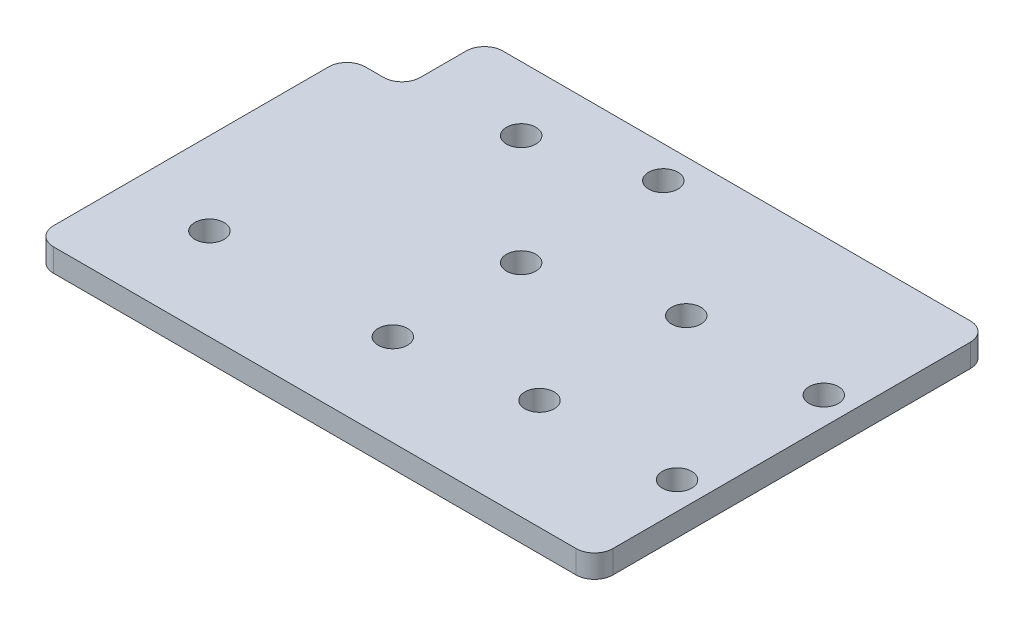
ISO-10303-21;
HEADER;
FILE_DESCRIPTION(('STEP AP214'),'2;1');
FILE_NAME('part.step','',(''),(''),'','','');
FILE_SCHEMA(('AUTOMOTIVE_DESIGN { 1 0 10303 214 1 1 1 1 }'));
ENDSEC;
DATA;
#1=APPLICATION_CONTEXT('core data for automotive mechanical design processes');
#2=APPLICATION_PROTOCOL_DEFINITION('international standard','automotive_design',2000,#1);
#3=PRODUCT_CONTEXT('',#1,'mechanical');
#4=PRODUCT('Part','Part','',(#3));
#5=PRODUCT_RELATED_PRODUCT_CATEGORY('part','',(#4));
#6=PRODUCT_DEFINITION_FORMATION('','',#4);
#7=PRODUCT_DEFINITION_CONTEXT('part definition',#1,'design');
#8=PRODUCT_DEFINITION('design','',#6,#7);
#9=PRODUCT_DEFINITION_SHAPE('','',#8);
#10=(LENGTH_UNIT() NAMED_UNIT(*) SI_UNIT(.MILLI.,.METRE.));
#11=(NAMED_UNIT(*) PLANE_ANGLE_UNIT() SI_UNIT($,.RADIAN.));
#12=(NAMED_UNIT(*) SI_UNIT($,.STERADIAN.) SOLID_ANGLE_UNIT());
#13=UNCERTAINTY_MEASURE_WITH_UNIT(LENGTH_MEASURE(1.E-05),#10,'distance_accuracy_value','');
#14=(GEOMETRIC_REPRESENTATION_CONTEXT(3) GLOBAL_UNCERTAINTY_ASSIGNED_CONTEXT((#13)) GLOBAL_UNIT_ASSIGNED_CONTEXT((#10,
#11,#12)) REPRESENTATION_CONTEXT('',''));
#15=CARTESIAN_POINT('',(0.,0.,0.));
#16=DIRECTION('',(0.,0.,1.));
#17=DIRECTION('',(1.,0.,0.));
#18=AXIS2_PLACEMENT_3D('',#15,#16,#17);
#19=CARTESIAN_POINT('',(0.,2.5,0.));
#20=DIRECTION('',(0.,1.,0.));
#21=DIRECTION('',(0.,0.,1.));
#22=AXIS2_PLACEMENT_3D('',#19,#20,#21);
#23=PLANE('',#22);
#24=CARTESIAN_POINT('',(-24.5,2.5,11.5));
#25=DIRECTION('',(0.,1.,0.));
#26=DIRECTION('',(0.,0.,1.));
#27=AXIS2_PLACEMENT_3D('',#24,#25,#26);
#28=CIRCLE('',#27,1.6);
#29=CARTESIAN_POINT('',(-24.5,2.5,13.1));
#30=VERTEX_POINT('',#29);
#31=EDGE_CURVE('E285',#30,#30,#28,.T.);
#32=ORIENTED_EDGE('',*,*,#31,.F.);
#33=EDGE_LOOP('',(#32));
#34=FACE_BOUND('',#33,.T.);
#35=CARTESIAN_POINT('',(-4.50000000000001,2.5,-2.5));
#36=DIRECTION('',(0.,1.,0.));
#37=DIRECTION('',(0.,0.,1.));
#38=AXIS2_PLACEMENT_3D('',#35,#36,#37);
#39=CIRCLE('',#38,1.6);
#40=CARTESIAN_POINT('',(-4.50000000000001,2.5,-0.900000000000004));
#41=VERTEX_POINT('',#40);
#42=EDGE_CURVE('E273',#41,#41,#39,.T.);
#43=ORIENTED_EDGE('',*,*,#42,.F.);
#44=EDGE_LOOP('',(#43));
#45=FACE_BOUND('',#44,.T.);
#46=CARTESIAN_POINT('',(9.50000000000001,2.5,-6.5));
#47=DIRECTION('',(0.,1.,0.));
#48=DIRECTION('',(0.,0.,1.));
#49=AXIS2_PLACEMENT_3D('',#46,#47,#48);
#50=CIRCLE('',#49,1.6);
#51=CARTESIAN_POINT('',(9.50000000000001,2.5,-4.9));
#52=VERTEX_POINT('',#51);
#53=EDGE_CURVE('E261',#52,#52,#50,.T.);
#54=ORIENTED_EDGE('',*,*,#53,.F.);
#55=EDGE_LOOP('',(#54));
#56=FACE_BOUND('',#55,.T.);
#57=CARTESIAN_POINT('',(9.50000000000001,2.5,9.5));
#58=DIRECTION('',(0.,1.,0.));
#59=DIRECTION('',(0.,0.,1.));
#60=AXIS2_PLACEMENT_3D('',#57,#58,#59);
#61=CIRCLE('',#60,1.6);
#62=CARTESIAN_POINT('',(9.50000000000001,2.5,11.1));
#63=VERTEX_POINT('',#62);
#64=EDGE_CURVE('E249',#63,#63,#61,.T.);
#65=ORIENTED_EDGE('',*,*,#64,.F.);
#66=EDGE_LOOP('',(#65));
#67=FACE_BOUND('',#66,.T.);
#68=DIRECTION('',(0.,0.,1.));
#69=VECTOR('',#68,1.);
#70=CARTESIAN_POINT('',(-33.5,2.5,21.5));
#71=LINE('',#70,#69);
#72=CARTESIAN_POINT('',(-33.5,2.5,-10.5));
#73=VERTEX_POINT('',#72);
#74=CARTESIAN_POINT('',(-33.5,2.5,19.5));
#75=VERTEX_POINT('',#74);
#76=EDGE_CURVE('E219',#73,#75,#71,.T.);
#77=ORIENTED_EDGE('',*,*,#76,.T.);
#78=CARTESIAN_POINT('',(-31.5,2.5,19.5));
#79=DIRECTION('',(0.,1.,0.));
#80=DIRECTION('',(0.,0.,1.));
#81=AXIS2_PLACEMENT_3D('',#78,#79,#80);
#82=CIRCLE('',#81,2.);
#83=CARTESIAN_POINT('',(-31.5,2.5,21.5));
#84=VERTEX_POINT('',#83);
#85=EDGE_CURVE('E182',#75,#84,#82,.T.);
#86=ORIENTED_EDGE('',*,*,#85,.T.);
#87=DIRECTION('',(1.,0.,0.));
#88=VECTOR('',#87,1.);
#89=CARTESIAN_POINT('',(-27.5,2.5,21.5));
#90=LINE('',#89,#88);
#91=CARTESIAN_POINT('',(25.5,2.5,21.5));
#92=VERTEX_POINT('',#91);
#93=EDGE_CURVE('E147',#84,#92,#90,.T.);
#94=ORIENTED_EDGE('',*,*,#93,.T.);
#95=CARTESIAN_POINT('',(25.5,2.5,19.5));
#96=DIRECTION('',(0.,1.,0.));
#97=DIRECTION('',(0.,0.,1.));
#98=AXIS2_PLACEMENT_3D('',#95,#96,#97);
#99=CIRCLE('',#98,2.);
#100=CARTESIAN_POINT('',(27.5,2.5,19.5));
#101=VERTEX_POINT('',#100);
#102=EDGE_CURVE('E174',#92,#101,#99,.T.);
#103=ORIENTED_EDGE('',*,*,#102,.T.);
#104=DIRECTION('',(0.,0.,-1.));
#105=VECTOR('',#104,1.);
#106=CARTESIAN_POINT('',(27.5,2.5,21.5));
#107=LINE('',#106,#105);
#108=CARTESIAN_POINT('',(27.5,2.5,-19.5));
#109=VERTEX_POINT('',#108);
#110=EDGE_CURVE('E154',#101,#109,#107,.T.);
#111=ORIENTED_EDGE('',*,*,#110,.T.);
#112=CARTESIAN_POINT('',(25.5,2.5,-19.5));
#113=DIRECTION('',(0.,1.,0.));
#114=DIRECTION('',(0.,0.,1.));
#115=AXIS2_PLACEMENT_3D('',#112,#113,#114);
#116=CIRCLE('',#115,2.);
#117=CARTESIAN_POINT('',(25.5,2.5,-21.5));
#118=VERTEX_POINT('',#117);
#119=EDGE_CURVE('E176',#109,#118,#116,.T.);
#120=ORIENTED_EDGE('',*,*,#119,.T.);
#121=DIRECTION('',(-1.,0.,0.));
#122=VECTOR('',#121,1.);
#123=CARTESIAN_POINT('',(27.5,2.5,-21.5));
#124=LINE('',#123,#122);
#125=CARTESIAN_POINT('',(-25.5,2.5,-21.5));
#126=VERTEX_POINT('',#125);
#127=EDGE_CURVE('E158',#118,#126,#124,.T.);
#128=ORIENTED_EDGE('',*,*,#127,.T.);
#129=CARTESIAN_POINT('',(-25.5,2.5,-19.5));
#130=DIRECTION('',(0.,1.,0.));
#131=DIRECTION('',(0.,0.,1.));
#132=AXIS2_PLACEMENT_3D('',#129,#130,#131);
#133=CIRCLE('',#132,2.);
#134=CARTESIAN_POINT('',(-27.5,2.5,-19.5));
#135=VERTEX_POINT('',#134);
#136=EDGE_CURVE('E178',#126,#135,#133,.T.);
#137=ORIENTED_EDGE('',*,*,#136,.T.);
#138=DIRECTION('',(0.,0.,1.));
#139=VECTOR('',#138,1.);
#140=CARTESIAN_POINT('',(-27.5,2.5,-12.5));
#141=LINE('',#140,#139);
#142=CARTESIAN_POINT('',(-27.5,2.5,-14.5));
#143=VERTEX_POINT('',#142);
#144=EDGE_CURVE('E220',#135,#143,#141,.T.);
#145=ORIENTED_EDGE('',*,*,#144,.T.);
#146=CARTESIAN_POINT('',(-29.5,2.5,-14.5));
#147=DIRECTION('',(0.,1.,0.));
#148=DIRECTION('',(0.,0.,1.));
#149=AXIS2_PLACEMENT_3D('',#146,#147,#148);
#150=CIRCLE('',#149,2.);
#151=CARTESIAN_POINT('',(-29.5,2.5,-12.5));
#152=VERTEX_POINT('',#151);
#153=EDGE_CURVE('E11',#143,#152,#150,.F.);
#154=ORIENTED_EDGE('',*,*,#153,.T.);
#155=DIRECTION('',(-1.,0.,0.));
#156=VECTOR('',#155,1.);
#157=CARTESIAN_POINT('',(-27.5,2.5,-12.5));
#158=LINE('',#157,#156);
#159=CARTESIAN_POINT('',(-31.5,2.5,-12.5));
#160=VERTEX_POINT('',#159);
#161=EDGE_CURVE('E217',#152,#160,#158,.T.);
#162=ORIENTED_EDGE('',*,*,#161,.T.);
#163=CARTESIAN_POINT('',(-31.5,2.5,-10.5));
#164=DIRECTION('',(0.,1.,0.));
#165=DIRECTION('',(0.,0.,1.));
#166=AXIS2_PLACEMENT_3D('',#163,#164,#165);
#167=CIRCLE('',#166,2.);
#168=EDGE_CURVE('E180',#160,#73,#167,.T.);
#169=ORIENTED_EDGE('',*,*,#168,.T.);
#170=EDGE_LOOP('',(#77,#86,#94,#103,#111,#120,#128,#137,#145,#154,#162,#169));
#171=FACE_BOUND('',#170,.T.);
#172=CARTESIAN_POINT('',(24.5,2.5,9.5));
#173=DIRECTION('',(0.,1.,0.));
#174=DIRECTION('',(0.,0.,1.));
#175=AXIS2_PLACEMENT_3D('',#172,#173,#174);
#176=CIRCLE('',#175,1.6);
#177=CARTESIAN_POINT('',(24.5,2.5,11.1));
#178=VERTEX_POINT('',#177);
#179=EDGE_CURVE('E231',#178,#178,#176,.T.);
#180=ORIENTED_EDGE('',*,*,#179,.F.);
#181=EDGE_LOOP('',(#180));
#182=FACE_BOUND('',#181,.T.);
#183=CARTESIAN_POINT('',(24.5,2.5,-6.5));
#184=DIRECTION('',(0.,1.,0.));
#185=DIRECTION('',(0.,0.,1.));
#186=AXIS2_PLACEMENT_3D('',#183,#184,#185);
#187=CIRCLE('',#186,1.60000000000001);
#188=CARTESIAN_POINT('',(24.5,2.5,-4.9));
#189=VERTEX_POINT('',#188);
#190=EDGE_CURVE('E255',#189,#189,#187,.T.);
#191=ORIENTED_EDGE('',*,*,#190,.F.);
#192=EDGE_LOOP('',(#191));
#193=FACE_BOUND('',#192,.T.);
#194=CARTESIAN_POINT('',(-4.50000000000001,2.5,-18.));
#195=DIRECTION('',(0.,1.,0.));
#196=DIRECTION('',(0.,0.,1.));
#197=AXIS2_PLACEMENT_3D('',#194,#195,#196);
#198=CIRCLE('',#197,1.6);
#199=CARTESIAN_POINT('',(-4.50000000000001,2.5,-16.4));
#200=VERTEX_POINT('',#199);
#201=EDGE_CURVE('E267',#200,#200,#198,.T.);
#202=ORIENTED_EDGE('',*,*,#201,.F.);
#203=EDGE_LOOP('',(#202));
#204=FACE_BOUND('',#203,.T.);
#205=CARTESIAN_POINT('',(-4.50000000000001,2.5,11.5));
#206=DIRECTION('',(0.,1.,0.));
#207=DIRECTION('',(0.,0.,1.));
#208=AXIS2_PLACEMENT_3D('',#205,#206,#207);
#209=CIRCLE('',#208,1.6);
#210=CARTESIAN_POINT('',(-4.50000000000001,2.5,13.1));
#211=VERTEX_POINT('',#210);
#212=EDGE_CURVE('E279',#211,#211,#209,.T.);
#213=ORIENTED_EDGE('',*,*,#212,.F.);
#214=EDGE_LOOP('',(#213));
#215=FACE_BOUND('',#214,.T.);
#216=CARTESIAN_POINT('',(-16.5,2.5,-14.5));
#217=DIRECTION('',(0.,1.,0.));
#218=DIRECTION('',(0.,0.,1.));
#219=AXIS2_PLACEMENT_3D('',#216,#217,#218);
#220=CIRCLE('',#219,1.6);
#221=CARTESIAN_POINT('',(-16.5,2.5,-12.9));
#222=VERTEX_POINT('',#221);
#223=EDGE_CURVE('E291',#222,#222,#220,.T.);
#224=ORIENTED_EDGE('',*,*,#223,.F.);
#225=EDGE_LOOP('',(#224));
#226=FACE_BOUND('',#225,.T.);
#227=ADVANCED_FACE('F38',(#34,#45,#56,#67,#171,#182,#193,#204,#215,#226),#23,.T.);
#228=CARTESIAN_POINT('',(0.,0.,0.));
#229=DIRECTION('',(0.,1.,0.));
#230=DIRECTION('',(0.,0.,1.));
#231=AXIS2_PLACEMENT_3D('',#228,#229,#230);
#232=PLANE('',#231);
#233=DIRECTION('',(1.,0.,0.));
#234=VECTOR('',#233,1.);
#235=CARTESIAN_POINT('',(27.5,0.,21.5));
#236=LINE('',#235,#234);
#237=CARTESIAN_POINT('',(-31.5,0.,21.5));
#238=VERTEX_POINT('',#237);
#239=CARTESIAN_POINT('',(25.5,0.,21.5));
#240=VERTEX_POINT('',#239);
#241=EDGE_CURVE('E144',#238,#240,#236,.T.);
#242=ORIENTED_EDGE('',*,*,#241,.F.);
#243=CARTESIAN_POINT('',(-31.5,0.,19.5));
#244=DIRECTION('',(0.,1.,0.));
#245=DIRECTION('',(0.,0.,1.));
#246=AXIS2_PLACEMENT_3D('',#243,#244,#245);
#247=CIRCLE('',#246,2.);
#248=CARTESIAN_POINT('',(-33.5,0.,19.5));
#249=VERTEX_POINT('',#248);
#250=EDGE_CURVE('E127',#238,#249,#247,.F.);
#251=ORIENTED_EDGE('',*,*,#250,.T.);
#252=DIRECTION('',(0.,0.,1.));
#253=VECTOR('',#252,1.);
#254=CARTESIAN_POINT('',(-33.5,0.,21.5));
#255=LINE('',#254,#253);
#256=CARTESIAN_POINT('',(-33.5,0.,-10.5));
#257=VERTEX_POINT('',#256);
#258=EDGE_CURVE('E155',#257,#249,#255,.T.);
#259=ORIENTED_EDGE('',*,*,#258,.F.);
#260=CARTESIAN_POINT('',(-31.5,0.,-10.5));
#261=DIRECTION('',(0.,1.,0.));
#262=DIRECTION('',(0.,0.,1.));
#263=AXIS2_PLACEMENT_3D('',#260,#261,#262);
#264=CIRCLE('',#263,2.);
#265=CARTESIAN_POINT('',(-31.5,0.,-12.5));
#266=VERTEX_POINT('',#265);
#267=EDGE_CURVE('E138',#257,#266,#264,.F.);
#268=ORIENTED_EDGE('',*,*,#267,.T.);
#269=DIRECTION('',(-1.,0.,0.));
#270=VECTOR('',#269,1.);
#271=CARTESIAN_POINT('',(-27.5,0.,-12.5));
#272=LINE('',#271,#270);
#273=CARTESIAN_POINT('',(-29.5,0.,-12.5));
#274=VERTEX_POINT('',#273);
#275=EDGE_CURVE('E160',#274,#266,#272,.T.);
#276=ORIENTED_EDGE('',*,*,#275,.F.);
#277=CARTESIAN_POINT('',(-29.5,0.,-14.5));
#278=DIRECTION('',(0.,1.,0.));
#279=DIRECTION('',(0.,0.,1.));
#280=AXIS2_PLACEMENT_3D('',#277,#278,#279);
#281=CIRCLE('',#280,2.);
#282=CARTESIAN_POINT('',(-27.5,0.,-14.5));
#283=VERTEX_POINT('',#282);
#284=EDGE_CURVE('E46',#274,#283,#281,.T.);
#285=ORIENTED_EDGE('',*,*,#284,.T.);
#286=DIRECTION('',(0.,0.,1.));
#287=VECTOR('',#286,1.);
#288=CARTESIAN_POINT('',(-27.5,0.,-12.5));
#289=LINE('',#288,#287);
#290=CARTESIAN_POINT('',(-27.5,0.,-19.5));
#291=VERTEX_POINT('',#290);
#292=EDGE_CURVE('E205',#291,#283,#289,.T.);
#293=ORIENTED_EDGE('',*,*,#292,.F.);
#294=CARTESIAN_POINT('',(-25.5,0.,-19.5));
#295=DIRECTION('',(0.,1.,0.));
#296=DIRECTION('',(0.,0.,1.));
#297=AXIS2_PLACEMENT_3D('',#294,#295,#296);
#298=CIRCLE('',#297,2.);
#299=CARTESIAN_POINT('',(-25.5,0.,-21.5));
#300=VERTEX_POINT('',#299);
#301=EDGE_CURVE('E168',#291,#300,#298,.F.);
#302=ORIENTED_EDGE('',*,*,#301,.T.);
#303=DIRECTION('',(-1.,0.,0.));
#304=VECTOR('',#303,1.);
#305=CARTESIAN_POINT('',(27.5,0.,-21.5));
#306=LINE('',#305,#304);
#307=CARTESIAN_POINT('',(25.5,0.,-21.5));
#308=VERTEX_POINT('',#307);
#309=EDGE_CURVE('E213',#308,#300,#306,.T.);
#310=ORIENTED_EDGE('',*,*,#309,.F.);
#311=CARTESIAN_POINT('',(25.5,0.,-19.5));
#312=DIRECTION('',(0.,1.,0.));
#313=DIRECTION('',(0.,0.,1.));
#314=AXIS2_PLACEMENT_3D('',#311,#312,#313);
#315=CIRCLE('',#314,2.);
#316=CARTESIAN_POINT('',(27.5,0.,-19.5));
#317=VERTEX_POINT('',#316);
#318=EDGE_CURVE('E166',#308,#317,#315,.F.);
#319=ORIENTED_EDGE('',*,*,#318,.T.);
#320=DIRECTION('',(0.,0.,-1.));
#321=VECTOR('',#320,1.);
#322=CARTESIAN_POINT('',(27.5,0.,21.5));
#323=LINE('',#322,#321);
#324=CARTESIAN_POINT('',(27.5,0.,19.5));
#325=VERTEX_POINT('',#324);
#326=EDGE_CURVE('E228',#325,#317,#323,.T.);
#327=ORIENTED_EDGE('',*,*,#326,.F.);
#328=CARTESIAN_POINT('',(25.5,0.,19.5));
#329=DIRECTION('',(0.,1.,0.));
#330=DIRECTION('',(0.,0.,1.));
#331=AXIS2_PLACEMENT_3D('',#328,#329,#330);
#332=CIRCLE('',#331,2.);
#333=EDGE_CURVE('E148',#325,#240,#332,.F.);
#334=ORIENTED_EDGE('',*,*,#333,.T.);
#335=EDGE_LOOP('',(#242,#251,#259,#268,#276,#285,#293,#302,#310,#319,#327,#334));
#336=FACE_BOUND('',#335,.T.);
#337=CARTESIAN_POINT('',(24.5,0.,9.5));
#338=DIRECTION('',(0.,1.,0.));
#339=DIRECTION('',(0.,0.,1.));
#340=AXIS2_PLACEMENT_3D('',#337,#338,#339);
#341=CIRCLE('',#340,1.6);
#342=CARTESIAN_POINT('',(24.5,0.,11.1));
#343=VERTEX_POINT('',#342);
#344=EDGE_CURVE('E246',#343,#343,#341,.T.);
#345=ORIENTED_EDGE('',*,*,#344,.T.);
#346=EDGE_LOOP('',(#345));
#347=FACE_BOUND('',#346,.T.);
#348=CARTESIAN_POINT('',(9.50000000000001,0.,9.5));
#349=DIRECTION('',(0.,1.,0.));
#350=DIRECTION('',(0.,0.,1.));
#351=AXIS2_PLACEMENT_3D('',#348,#349,#350);
#352=CIRCLE('',#351,1.6);
#353=CARTESIAN_POINT('',(9.50000000000001,0.,11.1));
#354=VERTEX_POINT('',#353);
#355=EDGE_CURVE('E252',#354,#354,#352,.T.);
#356=ORIENTED_EDGE('',*,*,#355,.T.);
#357=EDGE_LOOP('',(#356));
#358=FACE_BOUND('',#357,.T.);
#359=CARTESIAN_POINT('',(24.5,0.,-6.5));
#360=DIRECTION('',(0.,1.,0.));
#361=DIRECTION('',(0.,0.,1.));
#362=AXIS2_PLACEMENT_3D('',#359,#360,#361);
#363=CIRCLE('',#362,1.60000000000001);
#364=CARTESIAN_POINT('',(24.5,0.,-4.9));
#365=VERTEX_POINT('',#364);
#366=EDGE_CURVE('E258',#365,#365,#363,.T.);
#367=ORIENTED_EDGE('',*,*,#366,.T.);
#368=EDGE_LOOP('',(#367));
#369=FACE_BOUND('',#368,.T.);
#370=CARTESIAN_POINT('',(9.50000000000001,0.,-6.5));
#371=DIRECTION('',(0.,1.,0.));
#372=DIRECTION('',(0.,0.,1.));
#373=AXIS2_PLACEMENT_3D('',#370,#371,#372);
#374=CIRCLE('',#373,1.6);
#375=CARTESIAN_POINT('',(9.50000000000001,0.,-4.9));
#376=VERTEX_POINT('',#375);
#377=EDGE_CURVE('E264',#376,#376,#374,.T.);
#378=ORIENTED_EDGE('',*,*,#377,.T.);
#379=EDGE_LOOP('',(#378));
#380=FACE_BOUND('',#379,.T.);
#381=CARTESIAN_POINT('',(-4.50000000000001,0.,-18.));
#382=DIRECTION('',(0.,1.,0.));
#383=DIRECTION('',(0.,0.,1.));
#384=AXIS2_PLACEMENT_3D('',#381,#382,#383);
#385=CIRCLE('',#384,1.6);
#386=CARTESIAN_POINT('',(-4.50000000000001,0.,-16.4));
#387=VERTEX_POINT('',#386);
#388=EDGE_CURVE('E270',#387,#387,#385,.T.);
#389=ORIENTED_EDGE('',*,*,#388,.T.);
#390=EDGE_LOOP('',(#389));
#391=FACE_BOUND('',#390,.T.);
#392=CARTESIAN_POINT('',(-4.50000000000001,0.,-2.5));
#393=DIRECTION('',(0.,1.,0.));
#394=DIRECTION('',(0.,0.,1.));
#395=AXIS2_PLACEMENT_3D('',#392,#393,#394);
#396=CIRCLE('',#395,1.6);
#397=CARTESIAN_POINT('',(-4.50000000000001,0.,-0.900000000000004));
#398=VERTEX_POINT('',#397);
#399=EDGE_CURVE('E276',#398,#398,#396,.T.);
#400=ORIENTED_EDGE('',*,*,#399,.T.);
#401=EDGE_LOOP('',(#400));
#402=FACE_BOUND('',#401,.T.);
#403=CARTESIAN_POINT('',(-4.50000000000001,0.,11.5));
#404=DIRECTION('',(0.,1.,0.));
#405=DIRECTION('',(0.,0.,1.));
#406=AXIS2_PLACEMENT_3D('',#403,#404,#405);
#407=CIRCLE('',#406,1.6);
#408=CARTESIAN_POINT('',(-4.50000000000001,0.,13.1));
#409=VERTEX_POINT('',#408);
#410=EDGE_CURVE('E282',#409,#409,#407,.T.);
#411=ORIENTED_EDGE('',*,*,#410,.T.);
#412=EDGE_LOOP('',(#411));
#413=FACE_BOUND('',#412,.T.);
#414=CARTESIAN_POINT('',(-24.5,0.,11.5));
#415=DIRECTION('',(0.,1.,0.));
#416=DIRECTION('',(0.,0.,1.));
#417=AXIS2_PLACEMENT_3D('',#414,#415,#416);
#418=CIRCLE('',#417,1.6);
#419=CARTESIAN_POINT('',(-24.5,0.,13.1));
#420=VERTEX_POINT('',#419);
#421=EDGE_CURVE('E288',#420,#420,#418,.T.);
#422=ORIENTED_EDGE('',*,*,#421,.T.);
#423=EDGE_LOOP('',(#422));
#424=FACE_BOUND('',#423,.T.);
#425=CARTESIAN_POINT('',(-16.5,0.,-14.5));
#426=DIRECTION('',(0.,1.,0.));
#427=DIRECTION('',(0.,0.,1.));
#428=AXIS2_PLACEMENT_3D('',#425,#426,#427);
#429=CIRCLE('',#428,1.6);
#430=CARTESIAN_POINT('',(-16.5,0.,-12.9));
#431=VERTEX_POINT('',#430);
#432=EDGE_CURVE('E294',#431,#431,#429,.T.);
#433=ORIENTED_EDGE('',*,*,#432,.T.);
#434=EDGE_LOOP('',(#433));
#435=FACE_BOUND('',#434,.T.);
#436=ADVANCED_FACE('F151',(#336,#347,#358,#369,#380,#391,#402,#413,#424,#435),#232,.F.);
#437=CARTESIAN_POINT('',(27.5,2.5,21.5));
#438=DIRECTION('',(-1.,0.,0.));
#439=DIRECTION('',(0.,0.,1.));
#440=AXIS2_PLACEMENT_3D('',#437,#438,#439);
#441=PLANE('',#440);
#442=ORIENTED_EDGE('',*,*,#326,.T.);
#443=DIRECTION('',(0.,-1.,0.));
#444=VECTOR('',#443,1.);
#445=CARTESIAN_POINT('',(27.5,2.5,-19.5));
#446=LINE('',#445,#444);
#447=EDGE_CURVE('E201',#317,#109,#446,.F.);
#448=ORIENTED_EDGE('',*,*,#447,.T.);
#449=ORIENTED_EDGE('',*,*,#110,.F.);
#450=DIRECTION('',(0.,-1.,0.));
#451=VECTOR('',#450,1.);
#452=CARTESIAN_POINT('',(27.5,2.5,19.5));
#453=LINE('',#452,#451);
#454=EDGE_CURVE('E198',#101,#325,#453,.T.);
#455=ORIENTED_EDGE('',*,*,#454,.T.);
#456=EDGE_LOOP('',(#442,#448,#449,#455));
#457=FACE_BOUND('',#456,.T.);
#458=ADVANCED_FACE('F310',(#457),#441,.F.);
#459=CARTESIAN_POINT('',(27.5,2.5,-21.5));
#460=DIRECTION('',(0.,0.,1.));
#461=DIRECTION('',(1.,0.,0.));
#462=AXIS2_PLACEMENT_3D('',#459,#460,#461);
#463=PLANE('',#462);
#464=ORIENTED_EDGE('',*,*,#309,.T.);
#465=DIRECTION('',(0.,-1.,0.));
#466=VECTOR('',#465,1.);
#467=CARTESIAN_POINT('',(-25.5,2.5,-21.5));
#468=LINE('',#467,#466);
#469=EDGE_CURVE('E196',#300,#126,#468,.F.);
#470=ORIENTED_EDGE('',*,*,#469,.T.);
#471=ORIENTED_EDGE('',*,*,#127,.F.);
#472=DIRECTION('',(0.,-1.,0.));
#473=VECTOR('',#472,1.);
#474=CARTESIAN_POINT('',(25.5,2.5,-21.5));
#475=LINE('',#474,#473);
#476=EDGE_CURVE('E193',#118,#308,#475,.T.);
#477=ORIENTED_EDGE('',*,*,#476,.T.);
#478=EDGE_LOOP('',(#464,#470,#471,#477));
#479=FACE_BOUND('',#478,.T.);
#480=ADVANCED_FACE('F236',(#479),#463,.F.);
#481=CARTESIAN_POINT('',(-27.5,2.5,-12.5));
#482=DIRECTION('',(1.,0.,0.));
#483=DIRECTION('',(0.,0.,-1.));
#484=AXIS2_PLACEMENT_3D('',#481,#482,#483);
#485=PLANE('',#484);
#486=ORIENTED_EDGE('',*,*,#292,.T.);
#487=DIRECTION('',(0.,-1.,0.));
#488=VECTOR('',#487,1.);
#489=CARTESIAN_POINT('',(-27.5,2.5,-14.5));
#490=LINE('',#489,#488);
#491=EDGE_CURVE('E191',#283,#143,#490,.F.);
#492=ORIENTED_EDGE('',*,*,#491,.T.);
#493=ORIENTED_EDGE('',*,*,#144,.F.);
#494=DIRECTION('',(0.,-1.,0.));
#495=VECTOR('',#494,1.);
#496=CARTESIAN_POINT('',(-27.5,2.5,-19.5));
#497=LINE('',#496,#495);
#498=EDGE_CURVE('E188',#135,#291,#497,.T.);
#499=ORIENTED_EDGE('',*,*,#498,.T.);
#500=EDGE_LOOP('',(#486,#492,#493,#499));
#501=FACE_BOUND('',#500,.T.);
#502=ADVANCED_FACE('F210',(#501),#485,.F.);
#503=CARTESIAN_POINT('',(-27.5,2.5,-12.5));
#504=DIRECTION('',(0.,0.,1.));
#505=DIRECTION('',(1.,0.,0.));
#506=AXIS2_PLACEMENT_3D('',#503,#504,#505);
#507=PLANE('',#506);
#508=ORIENTED_EDGE('',*,*,#275,.T.);
#509=DIRECTION('',(0.,-1.,0.));
#510=VECTOR('',#509,1.);
#511=CARTESIAN_POINT('',(-31.5,2.5,-12.5));
#512=LINE('',#511,#510);
#513=EDGE_CURVE('E53',#266,#160,#512,.F.);
#514=ORIENTED_EDGE('',*,*,#513,.T.);
#515=ORIENTED_EDGE('',*,*,#161,.F.);
#516=DIRECTION('',(0.,-1.,0.));
#517=VECTOR('',#516,1.);
#518=CARTESIAN_POINT('',(-29.5,0.,-12.5));
#519=LINE('',#518,#517);
#520=EDGE_CURVE('E184',#152,#274,#519,.T.);
#521=ORIENTED_EDGE('',*,*,#520,.T.);
#522=EDGE_LOOP('',(#508,#514,#515,#521));
#523=FACE_BOUND('',#522,.T.);
#524=ADVANCED_FACE('F216',(#523),#507,.F.);
#525=CARTESIAN_POINT('',(-33.5,2.5,21.5));
#526=DIRECTION('',(1.,0.,0.));
#527=DIRECTION('',(0.,0.,-1.));
#528=AXIS2_PLACEMENT_3D('',#525,#526,#527);
#529=PLANE('',#528);
#530=ORIENTED_EDGE('',*,*,#258,.T.);
#531=DIRECTION('',(0.,-1.,0.));
#532=VECTOR('',#531,1.);
#533=CARTESIAN_POINT('',(-33.5,2.5,19.5));
#534=LINE('',#533,#532);
#535=EDGE_CURVE('E132',#249,#75,#534,.F.);
#536=ORIENTED_EDGE('',*,*,#535,.T.);
#537=ORIENTED_EDGE('',*,*,#76,.F.);
#538=DIRECTION('',(0.,-1.,0.));
#539=VECTOR('',#538,1.);
#540=CARTESIAN_POINT('',(-33.5,2.5,-10.5));
#541=LINE('',#540,#539);
#542=EDGE_CURVE('E137',#73,#257,#541,.T.);
#543=ORIENTED_EDGE('',*,*,#542,.T.);
#544=EDGE_LOOP('',(#530,#536,#537,#543));
#545=FACE_BOUND('',#544,.T.);
#546=ADVANCED_FACE('F320',(#545),#529,.F.);
#547=CARTESIAN_POINT('',(27.5,2.5,21.5));
#548=DIRECTION('',(0.,0.,-1.));
#549=DIRECTION('',(-1.,0.,0.));
#550=AXIS2_PLACEMENT_3D('',#547,#548,#549);
#551=PLANE('',#550);
#552=ORIENTED_EDGE('',*,*,#93,.F.);
#553=DIRECTION('',(0.,-1.,0.));
#554=VECTOR('',#553,1.);
#555=CARTESIAN_POINT('',(-31.5,2.5,21.5));
#556=LINE('',#555,#554);
#557=EDGE_CURVE('E131',#84,#238,#556,.T.);
#558=ORIENTED_EDGE('',*,*,#557,.T.);
#559=ORIENTED_EDGE('',*,*,#241,.T.);
#560=DIRECTION('',(0.,-1.,0.));
#561=VECTOR('',#560,1.);
#562=CARTESIAN_POINT('',(25.5,2.5,21.5));
#563=LINE('',#562,#561);
#564=EDGE_CURVE('E149',#240,#92,#563,.F.);
#565=ORIENTED_EDGE('',*,*,#564,.T.);
#566=EDGE_LOOP('',(#552,#558,#559,#565));
#567=FACE_BOUND('',#566,.T.);
#568=ADVANCED_FACE('F143',(#567),#551,.F.);
#569=CARTESIAN_POINT('',(24.5,2.5,9.5));
#570=DIRECTION('',(0.,-1.,0.));
#571=DIRECTION('',(0.,0.,-1.));
#572=AXIS2_PLACEMENT_3D('',#569,#570,#571);
#573=CYLINDRICAL_SURFACE('',#572,1.6);
#574=ORIENTED_EDGE('',*,*,#179,.T.);
#575=EDGE_LOOP('',(#574));
#576=FACE_BOUND('',#575,.T.);
#577=ORIENTED_EDGE('',*,*,#344,.F.);
#578=EDGE_LOOP('',(#577));
#579=FACE_BOUND('',#578,.T.);
#580=ADVANCED_FACE('F315',(#576,#579),#573,.F.);
#581=CARTESIAN_POINT('',(9.50000000000001,2.5,9.5));
#582=DIRECTION('',(0.,-1.,0.));
#583=DIRECTION('',(0.,0.,-1.));
#584=AXIS2_PLACEMENT_3D('',#581,#582,#583);
#585=CYLINDRICAL_SURFACE('',#584,1.6);
#586=ORIENTED_EDGE('',*,*,#64,.T.);
#587=EDGE_LOOP('',(#586));
#588=FACE_BOUND('',#587,.T.);
#589=ORIENTED_EDGE('',*,*,#355,.F.);
#590=EDGE_LOOP('',(#589));
#591=FACE_BOUND('',#590,.T.);
#592=ADVANCED_FACE('F453',(#588,#591),#585,.F.);
#593=CARTESIAN_POINT('',(24.5,2.5,-6.5));
#594=DIRECTION('',(0.,-1.,0.));
#595=DIRECTION('',(0.,0.,-1.));
#596=AXIS2_PLACEMENT_3D('',#593,#594,#595);
#597=CYLINDRICAL_SURFACE('',#596,1.60000000000001);
#598=ORIENTED_EDGE('',*,*,#190,.T.);
#599=EDGE_LOOP('',(#598));
#600=FACE_BOUND('',#599,.T.);
#601=ORIENTED_EDGE('',*,*,#366,.F.);
#602=EDGE_LOOP('',(#601));
#603=FACE_BOUND('',#602,.T.);
#604=ADVANCED_FACE('F443',(#600,#603),#597,.F.);
#605=CARTESIAN_POINT('',(9.50000000000001,2.5,-6.5));
#606=DIRECTION('',(0.,-1.,0.));
#607=DIRECTION('',(0.,0.,-1.));
#608=AXIS2_PLACEMENT_3D('',#605,#606,#607);
#609=CYLINDRICAL_SURFACE('',#608,1.6);
#610=ORIENTED_EDGE('',*,*,#53,.T.);
#611=EDGE_LOOP('',(#610));
#612=FACE_BOUND('',#611,.T.);
#613=ORIENTED_EDGE('',*,*,#377,.F.);
#614=EDGE_LOOP('',(#613));
#615=FACE_BOUND('',#614,.T.);
#616=ADVANCED_FACE('F433',(#612,#615),#609,.F.);
#617=CARTESIAN_POINT('',(-4.50000000000001,2.5,-18.));
#618=DIRECTION('',(0.,-1.,0.));
#619=DIRECTION('',(0.,0.,-1.));
#620=AXIS2_PLACEMENT_3D('',#617,#618,#619);
#621=CYLINDRICAL_SURFACE('',#620,1.6);
#622=ORIENTED_EDGE('',*,*,#201,.T.);
#623=EDGE_LOOP('',(#622));
#624=FACE_BOUND('',#623,.T.);
#625=ORIENTED_EDGE('',*,*,#388,.F.);
#626=EDGE_LOOP('',(#625));
#627=FACE_BOUND('',#626,.T.);
#628=ADVANCED_FACE('F423',(#624,#627),#621,.F.);
#629=CARTESIAN_POINT('',(-4.50000000000001,2.5,-2.5));
#630=DIRECTION('',(0.,-1.,0.));
#631=DIRECTION('',(0.,0.,-1.));
#632=AXIS2_PLACEMENT_3D('',#629,#630,#631);
#633=CYLINDRICAL_SURFACE('',#632,1.6);
#634=ORIENTED_EDGE('',*,*,#42,.T.);
#635=EDGE_LOOP('',(#634));
#636=FACE_BOUND('',#635,.T.);
#637=ORIENTED_EDGE('',*,*,#399,.F.);
#638=EDGE_LOOP('',(#637));
#639=FACE_BOUND('',#638,.T.);
#640=ADVANCED_FACE('F413',(#636,#639),#633,.F.);
#641=CARTESIAN_POINT('',(-4.50000000000001,2.5,11.5));
#642=DIRECTION('',(0.,-1.,0.));
#643=DIRECTION('',(0.,0.,-1.));
#644=AXIS2_PLACEMENT_3D('',#641,#642,#643);
#645=CYLINDRICAL_SURFACE('',#644,1.6);
#646=ORIENTED_EDGE('',*,*,#212,.T.);
#647=EDGE_LOOP('',(#646));
#648=FACE_BOUND('',#647,.T.);
#649=ORIENTED_EDGE('',*,*,#410,.F.);
#650=EDGE_LOOP('',(#649));
#651=FACE_BOUND('',#650,.T.);
#652=ADVANCED_FACE('F403',(#648,#651),#645,.F.);
#653=CARTESIAN_POINT('',(-24.5,2.5,11.5));
#654=DIRECTION('',(0.,-1.,0.));
#655=DIRECTION('',(0.,0.,-1.));
#656=AXIS2_PLACEMENT_3D('',#653,#654,#655);
#657=CYLINDRICAL_SURFACE('',#656,1.6);
#658=ORIENTED_EDGE('',*,*,#31,.T.);
#659=EDGE_LOOP('',(#658));
#660=FACE_BOUND('',#659,.T.);
#661=ORIENTED_EDGE('',*,*,#421,.F.);
#662=EDGE_LOOP('',(#661));
#663=FACE_BOUND('',#662,.T.);
#664=ADVANCED_FACE('F394',(#660,#663),#657,.F.);
#665=CARTESIAN_POINT('',(-16.5,2.5,-14.5));
#666=DIRECTION('',(0.,-1.,0.));
#667=DIRECTION('',(0.,0.,-1.));
#668=AXIS2_PLACEMENT_3D('',#665,#666,#667);
#669=CYLINDRICAL_SURFACE('',#668,1.6);
#670=ORIENTED_EDGE('',*,*,#223,.T.);
#671=EDGE_LOOP('',(#670));
#672=FACE_BOUND('',#671,.T.);
#673=ORIENTED_EDGE('',*,*,#432,.F.);
#674=EDGE_LOOP('',(#673));
#675=FACE_BOUND('',#674,.T.);
#676=ADVANCED_FACE('F300',(#672,#675),#669,.F.);
#677=CARTESIAN_POINT('',(-31.5,2.5,19.5));
#678=DIRECTION('',(0.,-1.,0.));
#679=DIRECTION('',(0.,0.,-1.));
#680=AXIS2_PLACEMENT_3D('',#677,#678,#679);
#681=CYLINDRICAL_SURFACE('',#680,2.);
#682=ORIENTED_EDGE('',*,*,#85,.F.);
#683=ORIENTED_EDGE('',*,*,#535,.F.);
#684=ORIENTED_EDGE('',*,*,#250,.F.);
#685=ORIENTED_EDGE('',*,*,#557,.F.);
#686=EDGE_LOOP('',(#682,#683,#684,#685));
#687=FACE_BOUND('',#686,.T.);
#688=ADVANCED_FACE('F130',(#687),#681,.T.);
#689=CARTESIAN_POINT('',(-31.5,2.5,-10.5));
#690=DIRECTION('',(0.,-1.,0.));
#691=DIRECTION('',(0.,0.,-1.));
#692=AXIS2_PLACEMENT_3D('',#689,#690,#691);
#693=CYLINDRICAL_SURFACE('',#692,2.);
#694=ORIENTED_EDGE('',*,*,#168,.F.);
#695=ORIENTED_EDGE('',*,*,#513,.F.);
#696=ORIENTED_EDGE('',*,*,#267,.F.);
#697=ORIENTED_EDGE('',*,*,#542,.F.);
#698=EDGE_LOOP('',(#694,#695,#696,#697));
#699=FACE_BOUND('',#698,.T.);
#700=ADVANCED_FACE('F335',(#699),#693,.T.);
#701=CARTESIAN_POINT('',(-29.5,2.5,-14.5));
#702=DIRECTION('',(0.,1.,0.));
#703=DIRECTION('',(0.,0.,1.));
#704=AXIS2_PLACEMENT_3D('',#701,#702,#703);
#705=CYLINDRICAL_SURFACE('',#704,2.);
#706=ORIENTED_EDGE('',*,*,#153,.F.);
#707=ORIENTED_EDGE('',*,*,#491,.F.);
#708=ORIENTED_EDGE('',*,*,#284,.F.);
#709=ORIENTED_EDGE('',*,*,#520,.F.);
#710=EDGE_LOOP('',(#706,#707,#708,#709));
#711=FACE_BOUND('',#710,.T.);
#712=ADVANCED_FACE('F215',(#711),#705,.F.);
#713=CARTESIAN_POINT('',(-25.5,2.5,-19.5));
#714=DIRECTION('',(0.,-1.,0.));
#715=DIRECTION('',(0.,0.,-1.));
#716=AXIS2_PLACEMENT_3D('',#713,#714,#715);
#717=CYLINDRICAL_SURFACE('',#716,2.);
#718=ORIENTED_EDGE('',*,*,#136,.F.);
#719=ORIENTED_EDGE('',*,*,#469,.F.);
#720=ORIENTED_EDGE('',*,*,#301,.F.);
#721=ORIENTED_EDGE('',*,*,#498,.F.);
#722=EDGE_LOOP('',(#718,#719,#720,#721));
#723=FACE_BOUND('',#722,.T.);
#724=ADVANCED_FACE('F242',(#723),#717,.T.);
#725=CARTESIAN_POINT('',(25.5,2.5,-19.5));
#726=DIRECTION('',(0.,-1.,0.));
#727=DIRECTION('',(0.,0.,-1.));
#728=AXIS2_PLACEMENT_3D('',#725,#726,#727);
#729=CYLINDRICAL_SURFACE('',#728,2.);
#730=ORIENTED_EDGE('',*,*,#119,.F.);
#731=ORIENTED_EDGE('',*,*,#447,.F.);
#732=ORIENTED_EDGE('',*,*,#318,.F.);
#733=ORIENTED_EDGE('',*,*,#476,.F.);
#734=EDGE_LOOP('',(#730,#731,#732,#733));
#735=FACE_BOUND('',#734,.T.);
#736=ADVANCED_FACE('F342',(#735),#729,.T.);
#737=CARTESIAN_POINT('',(25.5,2.5,19.5));
#738=DIRECTION('',(0.,-1.,0.));
#739=DIRECTION('',(0.,0.,-1.));
#740=AXIS2_PLACEMENT_3D('',#737,#738,#739);
#741=CYLINDRICAL_SURFACE('',#740,2.);
#742=ORIENTED_EDGE('',*,*,#102,.F.);
#743=ORIENTED_EDGE('',*,*,#564,.F.);
#744=ORIENTED_EDGE('',*,*,#333,.F.);
#745=ORIENTED_EDGE('',*,*,#454,.F.);
#746=EDGE_LOOP('',(#742,#743,#744,#745));
#747=FACE_BOUND('',#746,.T.);
#748=ADVANCED_FACE('F40',(#747),#741,.T.);
#749=CLOSED_SHELL('',(#227,#436,#458,#480,#502,#524,#546,#568,#580,#592,#604,#616,#628,#640,
#652,#664,#676,#688,#700,#712,#724,#736,#748));
#750=MANIFOLD_SOLID_BREP('B2',#749);
#751=ADVANCED_BREP_SHAPE_REPRESENTATION('',(#18,#750),#14);
#752=SHAPE_DEFINITION_REPRESENTATION(#9,#751);
ENDSEC;
END-ISO-10303-21;
